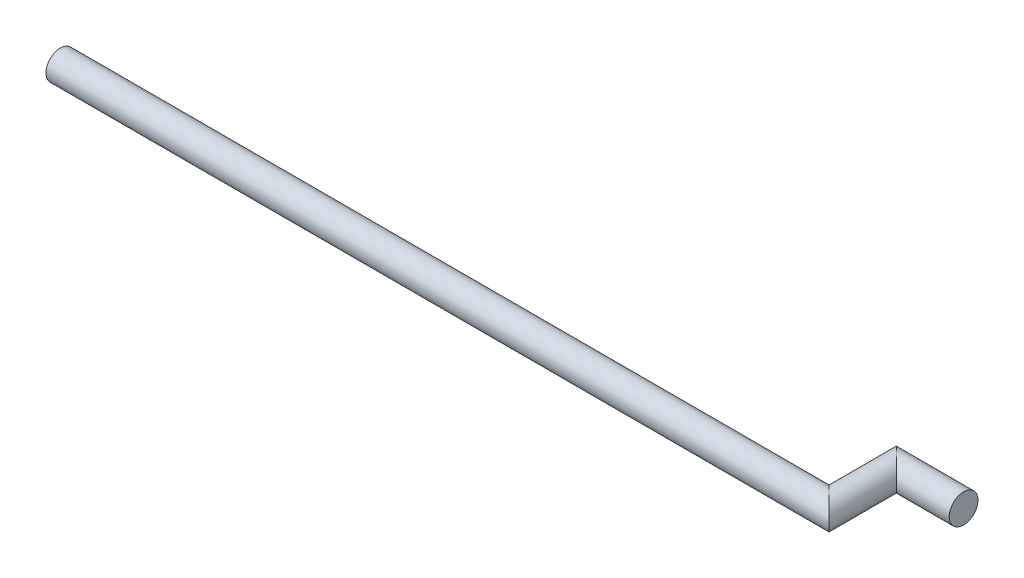
ISO-10303-21;
HEADER;
FILE_DESCRIPTION(('STEP AP214'),'2;1');
FILE_NAME('part.step','',(''),(''),'','','');
FILE_SCHEMA(('AUTOMOTIVE_DESIGN { 1 0 10303 214 1 1 1 1 }'));
ENDSEC;
DATA;
#1=APPLICATION_CONTEXT('core data for automotive mechanical design processes');
#2=APPLICATION_PROTOCOL_DEFINITION('international standard','automotive_design',2000,#1);
#3=PRODUCT_CONTEXT('',#1,'mechanical');
#4=PRODUCT('Part','Part','',(#3));
#5=PRODUCT_RELATED_PRODUCT_CATEGORY('part','',(#4));
#6=PRODUCT_DEFINITION_FORMATION('','',#4);
#7=PRODUCT_DEFINITION_CONTEXT('part definition',#1,'design');
#8=PRODUCT_DEFINITION('design','',#6,#7);
#9=PRODUCT_DEFINITION_SHAPE('','',#8);
#10=(LENGTH_UNIT() NAMED_UNIT(*) SI_UNIT(.MILLI.,.METRE.));
#11=(NAMED_UNIT(*) PLANE_ANGLE_UNIT() SI_UNIT($,.RADIAN.));
#12=(NAMED_UNIT(*) SI_UNIT($,.STERADIAN.) SOLID_ANGLE_UNIT());
#13=UNCERTAINTY_MEASURE_WITH_UNIT(LENGTH_MEASURE(1.E-05),#10,'distance_accuracy_value','');
#14=(GEOMETRIC_REPRESENTATION_CONTEXT(3) GLOBAL_UNCERTAINTY_ASSIGNED_CONTEXT((#13)) GLOBAL_UNIT_ASSIGNED_CONTEXT((#10,
#11,#12)) REPRESENTATION_CONTEXT('',''));
#15=CARTESIAN_POINT('',(0.,0.,0.));
#16=DIRECTION('',(0.,0.,1.));
#17=DIRECTION('',(1.,0.,0.));
#18=AXIS2_PLACEMENT_3D('',#15,#16,#17);
#19=CARTESIAN_POINT('',(43.5,0.,-3.5));
#20=DIRECTION('',(1.,0.,0.));
#21=DIRECTION('',(0.,0.,-1.));
#22=AXIS2_PLACEMENT_3D('',#19,#20,#21);
#23=PLANE('',#22);
#24=CARTESIAN_POINT('',(43.5,0.,-3.5));
#25=DIRECTION('',(1.,0.,0.));
#26=DIRECTION('',(0.,0.,-1.));
#27=AXIS2_PLACEMENT_3D('',#24,#25,#26);
#28=CIRCLE('',#27,0.75);
#29=CARTESIAN_POINT('',(43.5,0.,-4.25));
#30=VERTEX_POINT('',#29);
#31=EDGE_CURVE('E45',#30,#30,#28,.T.);
#32=ORIENTED_EDGE('',*,*,#31,.T.);
#33=EDGE_LOOP('',(#32));
#34=FACE_BOUND('',#33,.T.);
#35=ADVANCED_FACE('F42',(#34),#23,.T.);
#36=CARTESIAN_POINT('',(0.,0.,0.));
#37=DIRECTION('',(1.,0.,0.));
#38=DIRECTION('',(0.,0.,-1.));
#39=AXIS2_PLACEMENT_3D('',#36,#37,#38);
#40=PLANE('',#39);
#41=CARTESIAN_POINT('',(0.,0.,0.));
#42=DIRECTION('',(1.,0.,0.));
#43=DIRECTION('',(0.,0.,-1.));
#44=AXIS2_PLACEMENT_3D('',#41,#42,#43);
#45=CIRCLE('',#44,0.75);
#46=CARTESIAN_POINT('',(0.,0.,-0.75));
#47=VERTEX_POINT('',#46);
#48=EDGE_CURVE('E50',#47,#47,#45,.T.);
#49=ORIENTED_EDGE('',*,*,#48,.F.);
#50=EDGE_LOOP('',(#49));
#51=FACE_BOUND('',#50,.T.);
#52=ADVANCED_FACE('F70',(#51),#40,.F.);
#53=CARTESIAN_POINT('',(39.075,0.,-3.5));
#54=DIRECTION('',(1.,0.,0.));
#55=DIRECTION('',(0.,0.,-1.));
#56=AXIS2_PLACEMENT_3D('',#53,#54,#55);
#57=CYLINDRICAL_SURFACE('',#56,0.75);
#58=CARTESIAN_POINT('',(40.,0.,-3.50000000000001));
#59=DIRECTION('',(0.707106781186548,0.,-0.707106781186548));
#60=DIRECTION('',(-0.707106781186548,0.,-0.707106781186548));
#61=AXIS2_PLACEMENT_3D('',#58,#59,#60);
#62=ELLIPSE('',#61,1.06066017177982,0.75);
#63=CARTESIAN_POINT('',(39.25,0.,-4.25000000000001));
#64=VERTEX_POINT('',#63);
#65=EDGE_CURVE('E56',#64,#64,#62,.F.);
#66=ORIENTED_EDGE('',*,*,#65,.F.);
#67=EDGE_LOOP('',(#66));
#68=FACE_BOUND('',#67,.T.);
#69=ORIENTED_EDGE('',*,*,#31,.F.);
#70=EDGE_LOOP('',(#69));
#71=FACE_BOUND('',#70,.T.);
#72=ADVANCED_FACE('F67',(#68,#71),#57,.T.);
#73=CARTESIAN_POINT('',(40.,0.,0.924999999999993));
#74=DIRECTION('',(0.,0.,-1.));
#75=DIRECTION('',(-1.,0.,0.));
#76=AXIS2_PLACEMENT_3D('',#73,#74,#75);
#77=CYLINDRICAL_SURFACE('',#76,0.75);
#78=CARTESIAN_POINT('',(40.,0.,0.));
#79=DIRECTION('',(0.707106781186548,0.,-0.707106781186548));
#80=DIRECTION('',(0.707106781186548,0.,0.707106781186548));
#81=AXIS2_PLACEMENT_3D('',#78,#79,#80);
#82=ELLIPSE('',#81,1.06066017177982,0.75);
#83=CARTESIAN_POINT('',(40.75,0.,0.75));
#84=VERTEX_POINT('',#83);
#85=EDGE_CURVE('E10',#84,#84,#82,.F.);
#86=ORIENTED_EDGE('',*,*,#85,.F.);
#87=EDGE_LOOP('',(#86));
#88=FACE_BOUND('',#87,.T.);
#89=ORIENTED_EDGE('',*,*,#65,.T.);
#90=EDGE_LOOP('',(#89));
#91=FACE_BOUND('',#90,.T.);
#92=ADVANCED_FACE('F69',(#88,#91),#77,.T.);
#93=CARTESIAN_POINT('',(0.,0.,0.));
#94=DIRECTION('',(1.,0.,0.));
#95=DIRECTION('',(0.,0.,-1.));
#96=AXIS2_PLACEMENT_3D('',#93,#94,#95);
#97=CYLINDRICAL_SURFACE('',#96,0.75);
#98=ORIENTED_EDGE('',*,*,#48,.T.);
#99=EDGE_LOOP('',(#98));
#100=FACE_BOUND('',#99,.T.);
#101=ORIENTED_EDGE('',*,*,#85,.T.);
#102=EDGE_LOOP('',(#101));
#103=FACE_BOUND('',#102,.T.);
#104=ADVANCED_FACE('F77',(#100,#103),#97,.T.);
#105=CLOSED_SHELL('',(#35,#52,#72,#92,#104));
#106=MANIFOLD_SOLID_BREP('B2',#105);
#107=ADVANCED_BREP_SHAPE_REPRESENTATION('',(#18,#106),#14);
#108=SHAPE_DEFINITION_REPRESENTATION(#9,#107);
ENDSEC;
END-ISO-10303-21;
